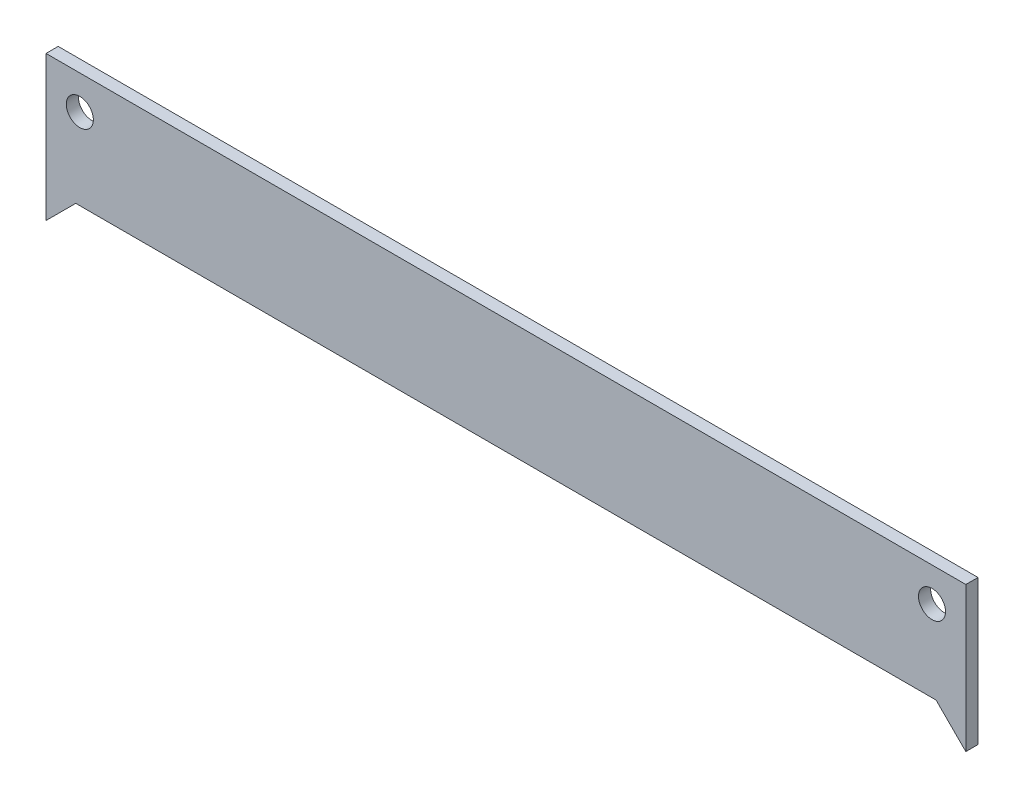
ISO-10303-21;
HEADER;
FILE_DESCRIPTION(('STEP AP214'),'2;1');
FILE_NAME('part.step','',(''),(''),'','','');
FILE_SCHEMA(('AUTOMOTIVE_DESIGN { 1 0 10303 214 1 1 1 1 }'));
ENDSEC;
DATA;
#1=APPLICATION_CONTEXT('core data for automotive mechanical design processes');
#2=APPLICATION_PROTOCOL_DEFINITION('international standard','automotive_design',2000,#1);
#3=PRODUCT_CONTEXT('',#1,'mechanical');
#4=PRODUCT('Part','Part','',(#3));
#5=PRODUCT_RELATED_PRODUCT_CATEGORY('part','',(#4));
#6=PRODUCT_DEFINITION_FORMATION('','',#4);
#7=PRODUCT_DEFINITION_CONTEXT('part definition',#1,'design');
#8=PRODUCT_DEFINITION('design','',#6,#7);
#9=PRODUCT_DEFINITION_SHAPE('','',#8);
#10=(LENGTH_UNIT() NAMED_UNIT(*) SI_UNIT(.MILLI.,.METRE.));
#11=(NAMED_UNIT(*) PLANE_ANGLE_UNIT() SI_UNIT($,.RADIAN.));
#12=(NAMED_UNIT(*) SI_UNIT($,.STERADIAN.) SOLID_ANGLE_UNIT());
#13=UNCERTAINTY_MEASURE_WITH_UNIT(LENGTH_MEASURE(1.E-05),#10,'distance_accuracy_value','');
#14=(GEOMETRIC_REPRESENTATION_CONTEXT(3) GLOBAL_UNCERTAINTY_ASSIGNED_CONTEXT((#13)) GLOBAL_UNIT_ASSIGNED_CONTEXT((#10,
#11,#12)) REPRESENTATION_CONTEXT('',''));
#15=CARTESIAN_POINT('',(0.,0.,0.));
#16=DIRECTION('',(0.,0.,1.));
#17=DIRECTION('',(1.,0.,0.));
#18=AXIS2_PLACEMENT_3D('',#15,#16,#17);
#19=CARTESIAN_POINT('',(0.,0.,0.9));
#20=DIRECTION('',(0.,0.,-1.));
#21=DIRECTION('',(-1.,0.,0.));
#22=AXIS2_PLACEMENT_3D('',#19,#20,#21);
#23=PLANE('',#22);
#24=DIRECTION('',(0.,-1.,0.));
#25=VECTOR('',#24,1.);
#26=CARTESIAN_POINT('',(-49.1436781609195,9.86781609195402,0.9));
#27=LINE('',#26,#25);
#28=CARTESIAN_POINT('',(-49.1436781609195,9.86781609195402,0.9));
#29=VERTEX_POINT('',#28);
#30=CARTESIAN_POINT('',(-49.1436781609195,-0.832183908045979,0.9));
#31=VERTEX_POINT('',#30);
#32=EDGE_CURVE('E85',#29,#31,#27,.T.);
#33=ORIENTED_EDGE('',*,*,#32,.T.);
#34=DIRECTION('',(0.707106781186534,0.707106781186561,0.));
#35=VECTOR('',#34,1.);
#36=CARTESIAN_POINT('',(-49.1436781609195,-0.832183908045979,0.9));
#37=LINE('',#36,#35);
#38=CARTESIAN_POINT('',(-46.9436781609196,1.36781609195402,0.9));
#39=VERTEX_POINT('',#38);
#40=EDGE_CURVE('E143',#31,#39,#37,.T.);
#41=ORIENTED_EDGE('',*,*,#40,.T.);
#42=DIRECTION('',(1.,0.,0.));
#43=VECTOR('',#42,1.);
#44=CARTESIAN_POINT('',(16.6563218390804,1.36781609195402,0.9));
#45=LINE('',#44,#43);
#46=CARTESIAN_POINT('',(16.6563218390804,1.36781609195402,0.9));
#47=VERTEX_POINT('',#46);
#48=EDGE_CURVE('E99',#39,#47,#45,.T.);
#49=ORIENTED_EDGE('',*,*,#48,.T.);
#50=DIRECTION('',(0.707106781186565,-0.707106781186531,0.));
#51=VECTOR('',#50,1.);
#52=CARTESIAN_POINT('',(18.8563218390805,-0.832183908045979,0.9));
#53=LINE('',#52,#51);
#54=CARTESIAN_POINT('',(18.8563218390805,-0.832183908045979,0.9));
#55=VERTEX_POINT('',#54);
#56=EDGE_CURVE('E93',#47,#55,#53,.T.);
#57=ORIENTED_EDGE('',*,*,#56,.T.);
#58=DIRECTION('',(0.,1.,0.));
#59=VECTOR('',#58,1.);
#60=CARTESIAN_POINT('',(18.8563218390805,1.36781609195402,0.9));
#61=LINE('',#60,#59);
#62=CARTESIAN_POINT('',(18.8563218390805,9.86781609195402,0.9));
#63=VERTEX_POINT('',#62);
#64=EDGE_CURVE('E97',#55,#63,#61,.T.);
#65=ORIENTED_EDGE('',*,*,#64,.T.);
#66=DIRECTION('',(-1.,0.,0.));
#67=VECTOR('',#66,1.);
#68=CARTESIAN_POINT('',(-49.1436781609195,9.86781609195402,0.9));
#69=LINE('',#68,#67);
#70=EDGE_CURVE('E50',#63,#29,#69,.T.);
#71=ORIENTED_EDGE('',*,*,#70,.T.);
#72=EDGE_LOOP('',(#33,#41,#49,#57,#65,#71));
#73=FACE_BOUND('',#72,.T.);
#74=CARTESIAN_POINT('',(-46.6436781609195,7.36781609195402,0.9));
#75=DIRECTION('',(0.,0.,1.));
#76=DIRECTION('',(1.,0.,0.));
#77=AXIS2_PLACEMENT_3D('',#74,#75,#76);
#78=CIRCLE('',#77,0.999999999999998);
#79=CARTESIAN_POINT('',(-45.6436781609195,7.36781609195402,0.9));
#80=VERTEX_POINT('',#79);
#81=EDGE_CURVE('E120',#80,#80,#78,.T.);
#82=ORIENTED_EDGE('',*,*,#81,.F.);
#83=EDGE_LOOP('',(#82));
#84=FACE_BOUND('',#83,.T.);
#85=CARTESIAN_POINT('',(16.3563218390805,7.36781609195402,0.9));
#86=DIRECTION('',(0.,0.,1.));
#87=DIRECTION('',(1.,0.,0.));
#88=AXIS2_PLACEMENT_3D('',#85,#86,#87);
#89=CIRCLE('',#88,1.);
#90=CARTESIAN_POINT('',(17.3563218390805,7.36781609195402,0.9));
#91=VERTEX_POINT('',#90);
#92=EDGE_CURVE('E150',#91,#91,#89,.T.);
#93=ORIENTED_EDGE('',*,*,#92,.F.);
#94=EDGE_LOOP('',(#93));
#95=FACE_BOUND('',#94,.T.);
#96=ADVANCED_FACE('F33',(#73,#84,#95),#23,.F.);
#97=CARTESIAN_POINT('',(0.,0.,0.));
#98=DIRECTION('',(0.,0.,-1.));
#99=DIRECTION('',(-1.,0.,0.));
#100=AXIS2_PLACEMENT_3D('',#97,#98,#99);
#101=PLANE('',#100);
#102=CARTESIAN_POINT('',(-46.6436781609195,7.36781609195402,0.));
#103=DIRECTION('',(0.,0.,1.));
#104=DIRECTION('',(1.,0.,0.));
#105=AXIS2_PLACEMENT_3D('',#102,#103,#104);
#106=CIRCLE('',#105,0.999999999999998);
#107=CARTESIAN_POINT('',(-45.6436781609195,7.36781609195402,0.));
#108=VERTEX_POINT('',#107);
#109=EDGE_CURVE('E147',#108,#108,#106,.T.);
#110=ORIENTED_EDGE('',*,*,#109,.T.);
#111=EDGE_LOOP('',(#110));
#112=FACE_BOUND('',#111,.T.);
#113=DIRECTION('',(0.,-1.,0.));
#114=VECTOR('',#113,1.);
#115=CARTESIAN_POINT('',(-49.1436781609195,1.36781609195402,0.));
#116=LINE('',#115,#114);
#117=CARTESIAN_POINT('',(-49.1436781609195,9.86781609195402,0.));
#118=VERTEX_POINT('',#117);
#119=CARTESIAN_POINT('',(-49.1436781609195,-0.832183908045979,0.));
#120=VERTEX_POINT('',#119);
#121=EDGE_CURVE('E79',#118,#120,#116,.T.);
#122=ORIENTED_EDGE('',*,*,#121,.F.);
#123=DIRECTION('',(-1.,0.,0.));
#124=VECTOR('',#123,1.);
#125=CARTESIAN_POINT('',(-49.1436781609195,9.86781609195402,0.));
#126=LINE('',#125,#124);
#127=CARTESIAN_POINT('',(18.8563218390805,9.86781609195402,0.));
#128=VERTEX_POINT('',#127);
#129=EDGE_CURVE('E126',#128,#118,#126,.T.);
#130=ORIENTED_EDGE('',*,*,#129,.F.);
#131=DIRECTION('',(0.,1.,0.));
#132=VECTOR('',#131,1.);
#133=CARTESIAN_POINT('',(18.8563218390805,9.86781609195402,0.));
#134=LINE('',#133,#132);
#135=CARTESIAN_POINT('',(18.8563218390805,-0.832183908045979,0.));
#136=VERTEX_POINT('',#135);
#137=EDGE_CURVE('E72',#136,#128,#134,.T.);
#138=ORIENTED_EDGE('',*,*,#137,.F.);
#139=DIRECTION('',(0.707106781186565,-0.707106781186531,0.));
#140=VECTOR('',#139,1.);
#141=CARTESIAN_POINT('',(18.8563218390805,-0.832183908045979,0.));
#142=LINE('',#141,#140);
#143=CARTESIAN_POINT('',(16.6563218390804,1.36781609195402,0.));
#144=VERTEX_POINT('',#143);
#145=EDGE_CURVE('E108',#144,#136,#142,.T.);
#146=ORIENTED_EDGE('',*,*,#145,.F.);
#147=DIRECTION('',(1.,0.,0.));
#148=VECTOR('',#147,1.);
#149=CARTESIAN_POINT('',(16.6563218390804,1.36781609195402,0.));
#150=LINE('',#149,#148);
#151=CARTESIAN_POINT('',(-46.9436781609196,1.36781609195402,0.));
#152=VERTEX_POINT('',#151);
#153=EDGE_CURVE('E122',#152,#144,#150,.T.);
#154=ORIENTED_EDGE('',*,*,#153,.F.);
#155=DIRECTION('',(0.707106781186534,0.707106781186561,0.));
#156=VECTOR('',#155,1.);
#157=CARTESIAN_POINT('',(-49.1436781609195,-0.832183908045979,0.));
#158=LINE('',#157,#156);
#159=EDGE_CURVE('E119',#120,#152,#158,.T.);
#160=ORIENTED_EDGE('',*,*,#159,.F.);
#161=EDGE_LOOP('',(#122,#130,#138,#146,#154,#160));
#162=FACE_BOUND('',#161,.T.);
#163=CARTESIAN_POINT('',(16.3563218390805,7.36781609195402,0.));
#164=DIRECTION('',(0.,0.,1.));
#165=DIRECTION('',(1.,0.,0.));
#166=AXIS2_PLACEMENT_3D('',#163,#164,#165);
#167=CIRCLE('',#166,1.);
#168=CARTESIAN_POINT('',(17.3563218390805,7.36781609195402,0.));
#169=VERTEX_POINT('',#168);
#170=EDGE_CURVE('E153',#169,#169,#167,.T.);
#171=ORIENTED_EDGE('',*,*,#170,.T.);
#172=EDGE_LOOP('',(#171));
#173=FACE_BOUND('',#172,.T.);
#174=ADVANCED_FACE('F138',(#112,#162,#173),#101,.T.);
#175=CARTESIAN_POINT('',(-49.1436781609195,1.36781609195402,0.9));
#176=DIRECTION('',(1.,0.,0.));
#177=DIRECTION('',(0.,0.,-1.));
#178=AXIS2_PLACEMENT_3D('',#175,#176,#177);
#179=PLANE('',#178);
#180=ORIENTED_EDGE('',*,*,#121,.T.);
#181=DIRECTION('',(0.,0.,-1.));
#182=VECTOR('',#181,1.);
#183=CARTESIAN_POINT('',(-49.1436781609195,-0.832183908045979,0.9));
#184=LINE('',#183,#182);
#185=EDGE_CURVE('E11',#31,#120,#184,.T.);
#186=ORIENTED_EDGE('',*,*,#185,.F.);
#187=ORIENTED_EDGE('',*,*,#32,.F.);
#188=DIRECTION('',(0.,0.,-1.));
#189=VECTOR('',#188,1.);
#190=CARTESIAN_POINT('',(-49.1436781609195,9.86781609195402,0.9));
#191=LINE('',#190,#189);
#192=EDGE_CURVE('E114',#29,#118,#191,.T.);
#193=ORIENTED_EDGE('',*,*,#192,.T.);
#194=EDGE_LOOP('',(#180,#186,#187,#193));
#195=FACE_BOUND('',#194,.T.);
#196=ADVANCED_FACE('F35',(#195),#179,.F.);
#197=CARTESIAN_POINT('',(-49.1436781609195,-0.832183908045979,0.9));
#198=DIRECTION('',(-0.707106781186561,0.707106781186534,0.));
#199=DIRECTION('',(-0.707106781186534,-0.707106781186561,0.));
#200=AXIS2_PLACEMENT_3D('',#197,#198,#199);
#201=PLANE('',#200);
#202=ORIENTED_EDGE('',*,*,#159,.T.);
#203=DIRECTION('',(0.,0.,-1.));
#204=VECTOR('',#203,1.);
#205=CARTESIAN_POINT('',(-46.9436781609196,1.36781609195402,0.9));
#206=LINE('',#205,#204);
#207=EDGE_CURVE('E42',#39,#152,#206,.T.);
#208=ORIENTED_EDGE('',*,*,#207,.F.);
#209=ORIENTED_EDGE('',*,*,#40,.F.);
#210=ORIENTED_EDGE('',*,*,#185,.T.);
#211=EDGE_LOOP('',(#202,#208,#209,#210));
#212=FACE_BOUND('',#211,.T.);
#213=ADVANCED_FACE('F180',(#212),#201,.F.);
#214=CARTESIAN_POINT('',(16.6563218390804,1.36781609195402,0.9));
#215=DIRECTION('',(0.,1.,0.));
#216=DIRECTION('',(-1.,0.,0.));
#217=AXIS2_PLACEMENT_3D('',#214,#215,#216);
#218=PLANE('',#217);
#219=ORIENTED_EDGE('',*,*,#153,.T.);
#220=DIRECTION('',(0.,0.,-1.));
#221=VECTOR('',#220,1.);
#222=CARTESIAN_POINT('',(16.6563218390804,1.36781609195402,0.9));
#223=LINE('',#222,#221);
#224=EDGE_CURVE('E109',#47,#144,#223,.T.);
#225=ORIENTED_EDGE('',*,*,#224,.F.);
#226=ORIENTED_EDGE('',*,*,#48,.F.);
#227=ORIENTED_EDGE('',*,*,#207,.T.);
#228=EDGE_LOOP('',(#219,#225,#226,#227));
#229=FACE_BOUND('',#228,.T.);
#230=ADVANCED_FACE('F135',(#229),#218,.F.);
#231=CARTESIAN_POINT('',(18.8563218390805,-0.832183908045979,0.9));
#232=DIRECTION('',(0.707106781186531,0.707106781186564,0.));
#233=DIRECTION('',(-0.707106781186564,0.707106781186531,0.));
#234=AXIS2_PLACEMENT_3D('',#231,#232,#233);
#235=PLANE('',#234);
#236=ORIENTED_EDGE('',*,*,#145,.T.);
#237=DIRECTION('',(0.,0.,-1.));
#238=VECTOR('',#237,1.);
#239=CARTESIAN_POINT('',(18.8563218390805,-0.832183908045979,0.9));
#240=LINE('',#239,#238);
#241=EDGE_CURVE('E105',#55,#136,#240,.T.);
#242=ORIENTED_EDGE('',*,*,#241,.F.);
#243=ORIENTED_EDGE('',*,*,#56,.F.);
#244=ORIENTED_EDGE('',*,*,#224,.T.);
#245=EDGE_LOOP('',(#236,#242,#243,#244));
#246=FACE_BOUND('',#245,.T.);
#247=ADVANCED_FACE('F106',(#246),#235,.F.);
#248=CARTESIAN_POINT('',(18.8563218390805,9.86781609195402,0.9));
#249=DIRECTION('',(-1.,0.,0.));
#250=DIRECTION('',(0.,0.,1.));
#251=AXIS2_PLACEMENT_3D('',#248,#249,#250);
#252=PLANE('',#251);
#253=ORIENTED_EDGE('',*,*,#137,.T.);
#254=DIRECTION('',(0.,0.,-1.));
#255=VECTOR('',#254,1.);
#256=CARTESIAN_POINT('',(18.8563218390805,9.86781609195402,0.9));
#257=LINE('',#256,#255);
#258=EDGE_CURVE('E110',#63,#128,#257,.T.);
#259=ORIENTED_EDGE('',*,*,#258,.F.);
#260=ORIENTED_EDGE('',*,*,#64,.F.);
#261=ORIENTED_EDGE('',*,*,#241,.T.);
#262=EDGE_LOOP('',(#253,#259,#260,#261));
#263=FACE_BOUND('',#262,.T.);
#264=ADVANCED_FACE('F112',(#263),#252,.F.);
#265=CARTESIAN_POINT('',(-49.1436781609195,9.86781609195402,0.9));
#266=DIRECTION('',(0.,-1.,0.));
#267=DIRECTION('',(0.,0.,-1.));
#268=AXIS2_PLACEMENT_3D('',#265,#266,#267);
#269=PLANE('',#268);
#270=ORIENTED_EDGE('',*,*,#129,.T.);
#271=ORIENTED_EDGE('',*,*,#192,.F.);
#272=ORIENTED_EDGE('',*,*,#70,.F.);
#273=ORIENTED_EDGE('',*,*,#258,.T.);
#274=EDGE_LOOP('',(#270,#271,#272,#273));
#275=FACE_BOUND('',#274,.T.);
#276=ADVANCED_FACE('F141',(#275),#269,.F.);
#277=CARTESIAN_POINT('',(-46.6436781609195,7.36781609195402,0.9));
#278=DIRECTION('',(0.,0.,-1.));
#279=DIRECTION('',(-1.,0.,0.));
#280=AXIS2_PLACEMENT_3D('',#277,#278,#279);
#281=CYLINDRICAL_SURFACE('',#280,0.999999999999998);
#282=ORIENTED_EDGE('',*,*,#81,.T.);
#283=EDGE_LOOP('',(#282));
#284=FACE_BOUND('',#283,.T.);
#285=ORIENTED_EDGE('',*,*,#109,.F.);
#286=EDGE_LOOP('',(#285));
#287=FACE_BOUND('',#286,.T.);
#288=ADVANCED_FACE('F170',(#284,#287),#281,.F.);
#289=CARTESIAN_POINT('',(16.3563218390805,7.36781609195402,0.9));
#290=DIRECTION('',(0.,0.,-1.));
#291=DIRECTION('',(-1.,0.,0.));
#292=AXIS2_PLACEMENT_3D('',#289,#290,#291);
#293=CYLINDRICAL_SURFACE('',#292,1.);
#294=ORIENTED_EDGE('',*,*,#92,.T.);
#295=EDGE_LOOP('',(#294));
#296=FACE_BOUND('',#295,.T.);
#297=ORIENTED_EDGE('',*,*,#170,.F.);
#298=EDGE_LOOP('',(#297));
#299=FACE_BOUND('',#298,.T.);
#300=ADVANCED_FACE('F159',(#296,#299),#293,.F.);
#301=CLOSED_SHELL('',(#96,#174,#196,#213,#230,#247,#264,#276,#288,#300));
#302=MANIFOLD_SOLID_BREP('B2',#301);
#303=ADVANCED_BREP_SHAPE_REPRESENTATION('',(#18,#302),#14);
#304=SHAPE_DEFINITION_REPRESENTATION(#9,#303);
ENDSEC;
END-ISO-10303-21;
